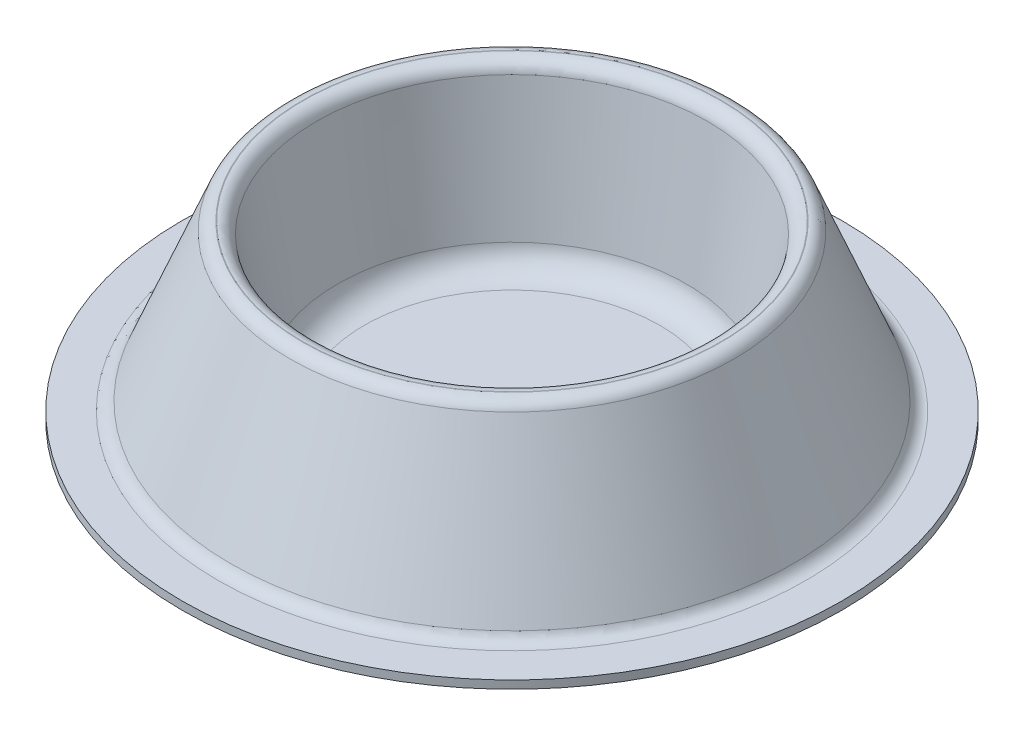
ISO-10303-21;
HEADER;
FILE_DESCRIPTION(('STEP AP214'),'2;1');
FILE_NAME('part.step','',(''),(''),'','','');
FILE_SCHEMA(('AUTOMOTIVE_DESIGN { 1 0 10303 214 1 1 1 1 }'));
ENDSEC;
DATA;
#1=APPLICATION_CONTEXT('core data for automotive mechanical design processes');
#2=APPLICATION_PROTOCOL_DEFINITION('international standard','automotive_design',2000,#1);
#3=PRODUCT_CONTEXT('',#1,'mechanical');
#4=PRODUCT('Part','Part','',(#3));
#5=PRODUCT_RELATED_PRODUCT_CATEGORY('part','',(#4));
#6=PRODUCT_DEFINITION_FORMATION('','',#4);
#7=PRODUCT_DEFINITION_CONTEXT('part definition',#1,'design');
#8=PRODUCT_DEFINITION('design','',#6,#7);
#9=PRODUCT_DEFINITION_SHAPE('','',#8);
#10=(LENGTH_UNIT() NAMED_UNIT(*) SI_UNIT(.MILLI.,.METRE.));
#11=(NAMED_UNIT(*) PLANE_ANGLE_UNIT() SI_UNIT($,.RADIAN.));
#12=(NAMED_UNIT(*) SI_UNIT($,.STERADIAN.) SOLID_ANGLE_UNIT());
#13=UNCERTAINTY_MEASURE_WITH_UNIT(LENGTH_MEASURE(1.E-05),#10,'distance_accuracy_value','');
#14=(GEOMETRIC_REPRESENTATION_CONTEXT(3) GLOBAL_UNCERTAINTY_ASSIGNED_CONTEXT((#13)) GLOBAL_UNIT_ASSIGNED_CONTEXT((#10,
#11,#12)) REPRESENTATION_CONTEXT('',''));
#15=CARTESIAN_POINT('',(0.,0.,0.));
#16=DIRECTION('',(0.,0.,1.));
#17=DIRECTION('',(1.,0.,0.));
#18=AXIS2_PLACEMENT_3D('',#15,#16,#17);
#19=CARTESIAN_POINT('',(0.,3.,0.));
#20=DIRECTION('',(0.,-1.,0.));
#21=DIRECTION('',(0.,0.,-1.));
#22=AXIS2_PLACEMENT_3D('',#19,#20,#21);
#23=CYLINDRICAL_SURFACE('',#22,122.5);
#24=CARTESIAN_POINT('',(0.,3.,0.));
#25=DIRECTION('',(0.,-1.,0.));
#26=DIRECTION('',(0.,0.,-1.));
#27=AXIS2_PLACEMENT_3D('',#24,#25,#26);
#28=CIRCLE('',#27,122.5);
#29=CARTESIAN_POINT('',(0.,3.,-122.5));
#30=VERTEX_POINT('',#29);
#31=EDGE_CURVE('E67',#30,#30,#28,.T.);
#32=ORIENTED_EDGE('',*,*,#31,.T.);
#33=EDGE_LOOP('',(#32));
#34=FACE_BOUND('',#33,.T.);
#35=CARTESIAN_POINT('',(0.,0.,0.));
#36=DIRECTION('',(0.,-1.,0.));
#37=DIRECTION('',(0.,0.,-1.));
#38=AXIS2_PLACEMENT_3D('',#35,#36,#37);
#39=CIRCLE('',#38,122.5);
#40=CARTESIAN_POINT('',(0.,0.,-122.5));
#41=VERTEX_POINT('',#40);
#42=EDGE_CURVE('E70',#41,#41,#39,.T.);
#43=ORIENTED_EDGE('',*,*,#42,.F.);
#44=EDGE_LOOP('',(#43));
#45=FACE_BOUND('',#44,.T.);
#46=ADVANCED_FACE('F35',(#34,#45),#23,.T.);
#47=CARTESIAN_POINT('',(122.5,3.,0.));
#48=DIRECTION('',(0.,1.,0.));
#49=DIRECTION('',(0.,0.,1.));
#50=AXIS2_PLACEMENT_3D('',#47,#48,#49);
#51=PLANE('',#50);
#52=CARTESIAN_POINT('',(0.,3.,0.));
#53=DIRECTION('',(0.,1.,0.));
#54=DIRECTION('',(0.,0.,1.));
#55=AXIS2_PLACEMENT_3D('',#52,#53,#54);
#56=CIRCLE('',#55,109.213910085017);
#57=CARTESIAN_POINT('',(0.,3.,109.213910085017));
#58=VERTEX_POINT('',#57);
#59=EDGE_CURVE('E64',#58,#58,#56,.F.);
#60=ORIENTED_EDGE('',*,*,#59,.T.);
#61=EDGE_LOOP('',(#60));
#62=FACE_BOUND('',#61,.T.);
#63=ORIENTED_EDGE('',*,*,#31,.F.);
#64=EDGE_LOOP('',(#63));
#65=FACE_BOUND('',#64,.T.);
#66=ADVANCED_FACE('F109',(#62,#65),#51,.T.);
#67=CARTESIAN_POINT('',(0.,3.,0.));
#68=DIRECTION('',(0.,-1.,0.));
#69=DIRECTION('',(0.,0.,-1.));
#70=AXIS2_PLACEMENT_3D('',#67,#68,#69);
#71=CONICAL_SURFACE('',#70,105.841367500805,0.383972435438757);
#72=CARTESIAN_POINT('',(0.,6.12696703292043,0.));
#73=DIRECTION('',(0.,-1.,0.));
#74=DIRECTION('',(0.,0.,-1.));
#75=AXIS2_PLACEMENT_3D('',#72,#73,#74);
#76=CIRCLE('',#75,104.577990812183);
#77=CARTESIAN_POINT('',(0.,6.12696703292043,-104.577990812183));
#78=VERTEX_POINT('',#77);
#79=EDGE_CURVE('E58',#78,#78,#76,.F.);
#80=ORIENTED_EDGE('',*,*,#79,.T.);
#81=EDGE_LOOP('',(#80));
#82=FACE_BOUND('',#81,.T.);
#83=CARTESIAN_POINT('',(0.,60.8730329670796,0.));
#84=DIRECTION('',(0.,1.,0.));
#85=DIRECTION('',(0.,0.,1.));
#86=AXIS2_PLACEMENT_3D('',#83,#84,#85);
#87=CIRCLE('',#86,82.4591444134815);
#88=CARTESIAN_POINT('',(0.,60.8730329670796,82.4591444134815));
#89=VERTEX_POINT('',#88);
#90=EDGE_CURVE('E61',#89,#89,#87,.F.);
#91=ORIENTED_EDGE('',*,*,#90,.T.);
#92=EDGE_LOOP('',(#91));
#93=FACE_BOUND('',#92,.T.);
#94=ADVANCED_FACE('F115',(#82,#93),#71,.T.);
#95=CARTESIAN_POINT('',(81.1957677248597,64.,0.));
#96=DIRECTION('',(0.,1.,0.));
#97=DIRECTION('',(0.,0.,1.));
#98=AXIS2_PLACEMENT_3D('',#95,#96,#97);
#99=PLANE('',#98);
#100=CARTESIAN_POINT('',(0.,64.,0.));
#101=DIRECTION('',(0.,1.,0.));
#102=DIRECTION('',(0.,0.,1.));
#103=AXIS2_PLACEMENT_3D('',#100,#101,#102);
#104=CIRCLE('',#103,77.8232251406476);
#105=CARTESIAN_POINT('',(0.,64.,77.8232251406476));
#106=VERTEX_POINT('',#105);
#107=EDGE_CURVE('E50',#106,#106,#104,.T.);
#108=ORIENTED_EDGE('',*,*,#107,.T.);
#109=EDGE_LOOP('',(#108));
#110=FACE_BOUND('',#109,.T.);
#111=CARTESIAN_POINT('',(0.,64.,0.));
#112=DIRECTION('',(0.,1.,0.));
#113=DIRECTION('',(0.,0.,1.));
#114=AXIS2_PLACEMENT_3D('',#111,#112,#113);
#115=CIRCLE('',#114,77.5967259603985);
#116=CARTESIAN_POINT('',(0.,64.,77.5967259603985));
#117=VERTEX_POINT('',#116);
#118=EDGE_CURVE('E55',#117,#117,#115,.F.);
#119=ORIENTED_EDGE('',*,*,#118,.T.);
#120=EDGE_LOOP('',(#119));
#121=FACE_BOUND('',#120,.T.);
#122=ADVANCED_FACE('F138',(#110,#121),#99,.T.);
#123=CARTESIAN_POINT('',(0.,64.,0.));
#124=DIRECTION('',(0.,1.,0.));
#125=DIRECTION('',(0.,0.,1.));
#126=AXIS2_PLACEMENT_3D('',#123,#124,#125);
#127=CONICAL_SURFACE('',#126,73.3403648734471,0.160331949877419);
#128=CARTESIAN_POINT('',(0.,11.4035409219376,0.));
#129=DIRECTION('',(0.,1.,0.));
#130=DIRECTION('',(0.,0.,1.));
#131=AXIS2_PLACEMENT_3D('',#128,#129,#130);
#132=CIRCLE('',#131,64.8344616217258);
#133=CARTESIAN_POINT('',(0.,11.4035409219376,64.8344616217258));
#134=VERTEX_POINT('',#133);
#135=EDGE_CURVE('E42',#134,#134,#132,.F.);
#136=ORIENTED_EDGE('',*,*,#135,.T.);
#137=EDGE_LOOP('',(#136));
#138=FACE_BOUND('',#137,.T.);
#139=CARTESIAN_POINT('',(0.,59.7982295390311,0.));
#140=DIRECTION('',(0.,-1.,0.));
#141=DIRECTION('',(0.,0.,-1.));
#142=AXIS2_PLACEMENT_3D('',#139,#140,#141);
#143=CIRCLE('',#142,72.6608542437695);
#144=CARTESIAN_POINT('',(0.,59.7982295390311,-72.6608542437695));
#145=VERTEX_POINT('',#144);
#146=EDGE_CURVE('E46',#145,#145,#143,.F.);
#147=ORIENTED_EDGE('',*,*,#146,.T.);
#148=EDGE_LOOP('',(#147));
#149=FACE_BOUND('',#148,.T.);
#150=ADVANCED_FACE('F140',(#138,#149),#127,.F.);
#151=CARTESIAN_POINT('',(63.4754403623707,3.,0.));
#152=DIRECTION('',(0.,1.,0.));
#153=DIRECTION('',(0.,0.,1.));
#154=AXIS2_PLACEMENT_3D('',#151,#152,#153);
#155=PLANE('',#154);
#156=CARTESIAN_POINT('',(0.,3.,0.));
#157=DIRECTION('',(0.,1.,0.));
#158=DIRECTION('',(0.,0.,1.));
#159=AXIS2_PLACEMENT_3D('',#156,#157,#158);
#160=CIRCLE('',#159,54.9627181884677);
#161=CARTESIAN_POINT('',(0.,3.,54.9627181884677));
#162=VERTEX_POINT('',#161);
#163=EDGE_CURVE('E10',#162,#162,#160,.T.);
#164=ORIENTED_EDGE('',*,*,#163,.T.);
#165=EDGE_LOOP('',(#164));
#166=FACE_BOUND('',#165,.T.);
#167=ADVANCED_FACE('F104',(#166),#155,.T.);
#168=CARTESIAN_POINT('',(0.,0.,0.));
#169=DIRECTION('',(0.,-1.,0.));
#170=DIRECTION('',(0.,0.,-1.));
#171=AXIS2_PLACEMENT_3D('',#168,#169,#170);
#172=PLANE('',#171);
#173=CARTESIAN_POINT('',(0.,0.,0.));
#174=DIRECTION('',(0.,1.,0.));
#175=DIRECTION('',(0.,0.,1.));
#176=AXIS2_PLACEMENT_3D('',#173,#174,#175);
#177=CIRCLE('',#176,109.213910085017);
#178=CARTESIAN_POINT('',(0.,0.,109.213910085017));
#179=VERTEX_POINT('',#178);
#180=EDGE_CURVE('E92',#179,#179,#177,.F.);
#181=ORIENTED_EDGE('',*,*,#180,.F.);
#182=EDGE_LOOP('',(#181));
#183=FACE_BOUND('',#182,.T.);
#184=ORIENTED_EDGE('',*,*,#42,.T.);
#185=EDGE_LOOP('',(#184));
#186=FACE_BOUND('',#185,.T.);
#187=ADVANCED_FACE('F100',(#183,#186),#172,.T.);
#188=CARTESIAN_POINT('',(0.,8.,0.));
#189=DIRECTION('',(0.,1.,0.));
#190=DIRECTION('',(0.,0.,1.));
#191=AXIS2_PLACEMENT_3D('',#188,#189,#190);
#192=TOROIDAL_SURFACE('',#191,109.213910085017,5.);
#193=ORIENTED_EDGE('',*,*,#79,.F.);
#194=EDGE_LOOP('',(#193));
#195=FACE_BOUND('',#194,.T.);
#196=ORIENTED_EDGE('',*,*,#59,.F.);
#197=EDGE_LOOP('',(#196));
#198=FACE_BOUND('',#197,.T.);
#199=ADVANCED_FACE('F103',(#195,#198),#192,.F.);
#200=CARTESIAN_POINT('',(0.,59.,0.));
#201=DIRECTION('',(0.,1.,0.));
#202=DIRECTION('',(0.,0.,1.));
#203=AXIS2_PLACEMENT_3D('',#200,#201,#202);
#204=TOROIDAL_SURFACE('',#203,77.8232251406476,5.);
#205=ORIENTED_EDGE('',*,*,#107,.F.);
#206=EDGE_LOOP('',(#205));
#207=FACE_BOUND('',#206,.T.);
#208=ORIENTED_EDGE('',*,*,#90,.F.);
#209=EDGE_LOOP('',(#208));
#210=FACE_BOUND('',#209,.T.);
#211=ADVANCED_FACE('F122',(#207,#210),#204,.T.);
#212=CARTESIAN_POINT('',(0.,59.,0.));
#213=DIRECTION('',(0.,1.,0.));
#214=DIRECTION('',(0.,0.,1.));
#215=AXIS2_PLACEMENT_3D('',#212,#213,#214);
#216=TOROIDAL_SURFACE('',#215,77.5967259603985,5.);
#217=ORIENTED_EDGE('',*,*,#146,.F.);
#218=EDGE_LOOP('',(#217));
#219=FACE_BOUND('',#218,.T.);
#220=ORIENTED_EDGE('',*,*,#118,.F.);
#221=EDGE_LOOP('',(#220));
#222=FACE_BOUND('',#221,.T.);
#223=ADVANCED_FACE('F125',(#219,#222),#216,.T.);
#224=CARTESIAN_POINT('',(0.,13.,0.));
#225=DIRECTION('',(0.,1.,0.));
#226=DIRECTION('',(0.,0.,1.));
#227=AXIS2_PLACEMENT_3D('',#224,#225,#226);
#228=TOROIDAL_SURFACE('',#227,54.9627181884677,10.);
#229=ORIENTED_EDGE('',*,*,#163,.F.);
#230=EDGE_LOOP('',(#229));
#231=FACE_BOUND('',#230,.T.);
#232=ORIENTED_EDGE('',*,*,#135,.F.);
#233=EDGE_LOOP('',(#232));
#234=FACE_BOUND('',#233,.T.);
#235=ADVANCED_FACE('F37',(#231,#234),#228,.F.);
#236=CARTESIAN_POINT('',(0.,1.87618021975225,0.));
#237=DIRECTION('',(0.,-1.,0.));
#238=DIRECTION('',(0.,0.,-1.));
#239=AXIS2_PLACEMENT_3D('',#236,#237,#238);
#240=CONICAL_SURFACE('',#239,103.059815937104,0.383972435438757);
#241=CARTESIAN_POINT('',(0.,5.00314725267268,0.));
#242=DIRECTION('',(0.,-1.,0.));
#243=DIRECTION('',(0.,0.,-1.));
#244=AXIS2_PLACEMENT_3D('',#241,#242,#243);
#245=CIRCLE('',#244,101.796439248482);
#246=CARTESIAN_POINT('',(0.,5.00314725267268,-101.796439248482));
#247=VERTEX_POINT('',#246);
#248=EDGE_CURVE('E86',#247,#247,#245,.F.);
#249=ORIENTED_EDGE('',*,*,#248,.F.);
#250=EDGE_LOOP('',(#249));
#251=FACE_BOUND('',#250,.T.);
#252=CARTESIAN_POINT('',(0.,59.7492131868318,0.));
#253=DIRECTION('',(0.,-1.,0.));
#254=DIRECTION('',(0.,0.,-1.));
#255=AXIS2_PLACEMENT_3D('',#252,#253,#254);
#256=CIRCLE('',#255,79.6775928497811);
#257=CARTESIAN_POINT('',(0.,59.7492131868318,-79.6775928497811));
#258=VERTEX_POINT('',#257);
#259=EDGE_CURVE('E89',#258,#258,#256,.T.);
#260=ORIENTED_EDGE('',*,*,#259,.F.);
#261=EDGE_LOOP('',(#260));
#262=FACE_BOUND('',#261,.T.);
#263=ADVANCED_FACE('F132',(#251,#262),#240,.F.);
#264=CARTESIAN_POINT('',(81.1957677248597,61.,0.));
#265=DIRECTION('',(0.,1.,0.));
#266=DIRECTION('',(0.,0.,1.));
#267=AXIS2_PLACEMENT_3D('',#264,#265,#266);
#268=PLANE('',#267);
#269=CARTESIAN_POINT('',(0.,61.,0.));
#270=DIRECTION('',(0.,1.,0.));
#271=DIRECTION('',(0.,0.,1.));
#272=AXIS2_PLACEMENT_3D('',#269,#270,#271);
#273=CIRCLE('',#272,77.8232251406476);
#274=CARTESIAN_POINT('',(0.,61.,77.8232251406476));
#275=VERTEX_POINT('',#274);
#276=EDGE_CURVE('E82',#275,#275,#273,.T.);
#277=ORIENTED_EDGE('',*,*,#276,.F.);
#278=EDGE_LOOP('',(#277));
#279=FACE_BOUND('',#278,.T.);
#280=CARTESIAN_POINT('',(0.,61.,0.));
#281=DIRECTION('',(0.,1.,0.));
#282=DIRECTION('',(0.,0.,1.));
#283=AXIS2_PLACEMENT_3D('',#280,#281,#282);
#284=CIRCLE('',#283,77.5967259603985);
#285=CARTESIAN_POINT('',(0.,61.,77.5967259603985));
#286=VERTEX_POINT('',#285);
#287=EDGE_CURVE('E83',#286,#286,#284,.F.);
#288=ORIENTED_EDGE('',*,*,#287,.F.);
#289=EDGE_LOOP('',(#288));
#290=FACE_BOUND('',#289,.T.);
#291=ADVANCED_FACE('F174',(#279,#290),#268,.F.);
#292=CARTESIAN_POINT('',(0.,63.5210622765813,0.));
#293=DIRECTION('',(0.,1.,0.));
#294=DIRECTION('',(0.,0.,1.));
#295=AXIS2_PLACEMENT_3D('',#292,#293,#294);
#296=CONICAL_SURFACE('',#295,76.3018879034245,0.160331949877419);
#297=CARTESIAN_POINT('',(0.,10.924603198519,0.));
#298=DIRECTION('',(0.,1.,0.));
#299=DIRECTION('',(0.,0.,1.));
#300=AXIS2_PLACEMENT_3D('',#297,#298,#299);
#301=CIRCLE('',#300,67.7959846517032);
#302=CARTESIAN_POINT('',(0.,10.924603198519,67.7959846517032));
#303=VERTEX_POINT('',#302);
#304=EDGE_CURVE('E76',#303,#303,#301,.F.);
#305=ORIENTED_EDGE('',*,*,#304,.F.);
#306=EDGE_LOOP('',(#305));
#307=FACE_BOUND('',#306,.T.);
#308=CARTESIAN_POINT('',(0.,59.3192918156124,0.));
#309=DIRECTION('',(0.,1.,0.));
#310=DIRECTION('',(0.,0.,1.));
#311=AXIS2_PLACEMENT_3D('',#308,#309,#310);
#312=CIRCLE('',#311,75.6223772737469);
#313=CARTESIAN_POINT('',(0.,59.3192918156124,75.6223772737469));
#314=VERTEX_POINT('',#313);
#315=EDGE_CURVE('E79',#314,#314,#312,.T.);
#316=ORIENTED_EDGE('',*,*,#315,.F.);
#317=EDGE_LOOP('',(#316));
#318=FACE_BOUND('',#317,.T.);
#319=ADVANCED_FACE('F170',(#307,#318),#296,.T.);
#320=CARTESIAN_POINT('',(63.4754403623707,0.,0.));
#321=DIRECTION('',(0.,1.,0.));
#322=DIRECTION('',(0.,0.,1.));
#323=AXIS2_PLACEMENT_3D('',#320,#321,#322);
#324=PLANE('',#323);
#325=CARTESIAN_POINT('',(0.,0.,0.));
#326=DIRECTION('',(0.,1.,0.));
#327=DIRECTION('',(0.,0.,1.));
#328=AXIS2_PLACEMENT_3D('',#325,#326,#327);
#329=CIRCLE('',#328,54.9627181884677);
#330=CARTESIAN_POINT('',(0.,0.,54.9627181884677));
#331=VERTEX_POINT('',#330);
#332=EDGE_CURVE('E73',#331,#331,#329,.T.);
#333=ORIENTED_EDGE('',*,*,#332,.F.);
#334=EDGE_LOOP('',(#333));
#335=FACE_BOUND('',#334,.T.);
#336=ADVANCED_FACE('F166',(#335),#324,.F.);
#337=CARTESIAN_POINT('',(0.,8.,0.));
#338=DIRECTION('',(0.,1.,0.));
#339=DIRECTION('',(0.,0.,1.));
#340=AXIS2_PLACEMENT_3D('',#337,#338,#339);
#341=TOROIDAL_SURFACE('',#340,109.213910085017,8.);
#342=ORIENTED_EDGE('',*,*,#248,.T.);
#343=EDGE_LOOP('',(#342));
#344=FACE_BOUND('',#343,.T.);
#345=ORIENTED_EDGE('',*,*,#180,.T.);
#346=EDGE_LOOP('',(#345));
#347=FACE_BOUND('',#346,.T.);
#348=ADVANCED_FACE('F98',(#344,#347),#341,.T.);
#349=CARTESIAN_POINT('',(0.,59.,0.));
#350=DIRECTION('',(0.,1.,0.));
#351=DIRECTION('',(0.,0.,1.));
#352=AXIS2_PLACEMENT_3D('',#349,#350,#351);
#353=TOROIDAL_SURFACE('',#352,77.8232251406476,2.);
#354=ORIENTED_EDGE('',*,*,#276,.T.);
#355=EDGE_LOOP('',(#354));
#356=FACE_BOUND('',#355,.T.);
#357=ORIENTED_EDGE('',*,*,#259,.T.);
#358=EDGE_LOOP('',(#357));
#359=FACE_BOUND('',#358,.T.);
#360=ADVANCED_FACE('F159',(#356,#359),#353,.F.);
#361=CARTESIAN_POINT('',(0.,59.,0.));
#362=DIRECTION('',(0.,1.,0.));
#363=DIRECTION('',(0.,0.,1.));
#364=AXIS2_PLACEMENT_3D('',#361,#362,#363);
#365=TOROIDAL_SURFACE('',#364,77.5967259603985,2.);
#366=ORIENTED_EDGE('',*,*,#315,.T.);
#367=EDGE_LOOP('',(#366));
#368=FACE_BOUND('',#367,.T.);
#369=ORIENTED_EDGE('',*,*,#287,.T.);
#370=EDGE_LOOP('',(#369));
#371=FACE_BOUND('',#370,.T.);
#372=ADVANCED_FACE('F155',(#368,#371),#365,.F.);
#373=CARTESIAN_POINT('',(0.,13.,0.));
#374=DIRECTION('',(0.,1.,0.));
#375=DIRECTION('',(0.,0.,1.));
#376=AXIS2_PLACEMENT_3D('',#373,#374,#375);
#377=TOROIDAL_SURFACE('',#376,54.9627181884677,13.);
#378=ORIENTED_EDGE('',*,*,#332,.T.);
#379=EDGE_LOOP('',(#378));
#380=FACE_BOUND('',#379,.T.);
#381=ORIENTED_EDGE('',*,*,#304,.T.);
#382=EDGE_LOOP('',(#381));
#383=FACE_BOUND('',#382,.T.);
#384=ADVANCED_FACE('F152',(#380,#383),#377,.T.);
#385=CLOSED_SHELL('',(#46,#66,#94,#122,#150,#167,#187,#199,#211,#223,#235,#263,#291,#319,#336,
#348,#360,#372,#384));
#386=MANIFOLD_SOLID_BREP('B2',#385);
#387=ADVANCED_BREP_SHAPE_REPRESENTATION('',(#18,#386),#14);
#388=SHAPE_DEFINITION_REPRESENTATION(#9,#387);
ENDSEC;
END-ISO-10303-21;
